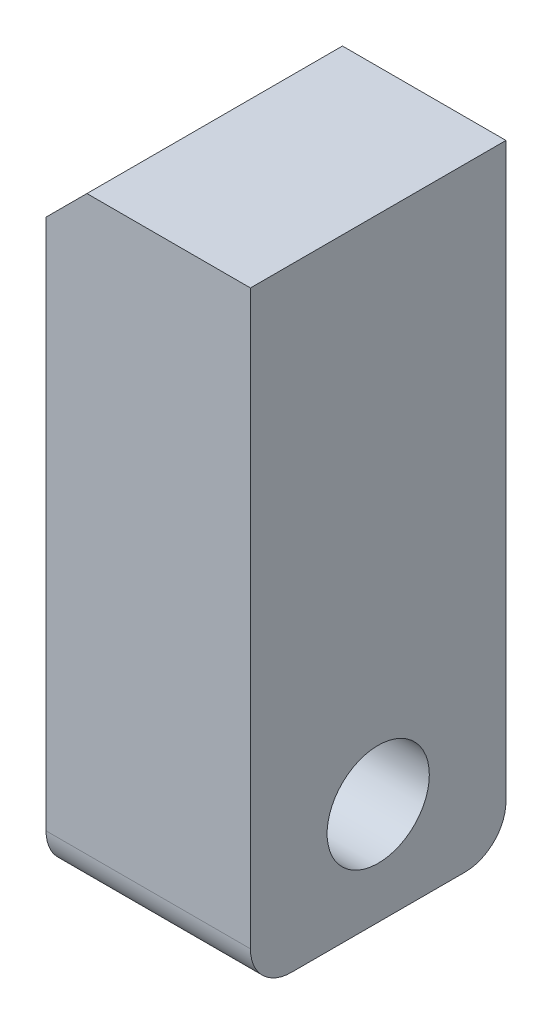
ISO-10303-21;
HEADER;
FILE_DESCRIPTION(('STEP AP214'),'2;1');
FILE_NAME('part.step','',(''),(''),'','','');
FILE_SCHEMA(('AUTOMOTIVE_DESIGN { 1 0 10303 214 1 1 1 1 }'));
ENDSEC;
DATA;
#1=APPLICATION_CONTEXT('core data for automotive mechanical design processes');
#2=APPLICATION_PROTOCOL_DEFINITION('international standard','automotive_design',2000,#1);
#3=PRODUCT_CONTEXT('',#1,'mechanical');
#4=PRODUCT('Part','Part','',(#3));
#5=PRODUCT_RELATED_PRODUCT_CATEGORY('part','',(#4));
#6=PRODUCT_DEFINITION_FORMATION('','',#4);
#7=PRODUCT_DEFINITION_CONTEXT('part definition',#1,'design');
#8=PRODUCT_DEFINITION('design','',#6,#7);
#9=PRODUCT_DEFINITION_SHAPE('','',#8);
#10=(LENGTH_UNIT() NAMED_UNIT(*) SI_UNIT(.MILLI.,.METRE.));
#11=(NAMED_UNIT(*) PLANE_ANGLE_UNIT() SI_UNIT($,.RADIAN.));
#12=(NAMED_UNIT(*) SI_UNIT($,.STERADIAN.) SOLID_ANGLE_UNIT());
#13=UNCERTAINTY_MEASURE_WITH_UNIT(LENGTH_MEASURE(1.E-05),#10,'distance_accuracy_value','');
#14=(GEOMETRIC_REPRESENTATION_CONTEXT(3) GLOBAL_UNCERTAINTY_ASSIGNED_CONTEXT((#13)) GLOBAL_UNIT_ASSIGNED_CONTEXT((#10,
#11,#12)) REPRESENTATION_CONTEXT('',''));
#15=CARTESIAN_POINT('',(0.,0.,0.));
#16=DIRECTION('',(0.,0.,1.));
#17=DIRECTION('',(1.,0.,0.));
#18=AXIS2_PLACEMENT_3D('',#15,#16,#17);
#19=CARTESIAN_POINT('',(10.,-15.,6.25));
#20=DIRECTION('',(0.,0.,-1.));
#21=DIRECTION('',(-1.,0.,0.));
#22=AXIS2_PLACEMENT_3D('',#19,#20,#21);
#23=PLANE('',#22);
#24=DIRECTION('',(-1.,0.,0.));
#25=VECTOR('',#24,1.);
#26=CARTESIAN_POINT('',(10.,15.,6.25));
#27=LINE('',#26,#25);
#28=CARTESIAN_POINT('',(10.,15.,6.25));
#29=VERTEX_POINT('',#28);
#30=CARTESIAN_POINT('',(2.,15.,6.25));
#31=VERTEX_POINT('',#30);
#32=EDGE_CURVE('E122',#29,#31,#27,.T.);
#33=ORIENTED_EDGE('',*,*,#32,.T.);
#34=DIRECTION('',(0.707106781186547,0.707106781186548,0.));
#35=VECTOR('',#34,1.);
#36=CARTESIAN_POINT('',(2.,15.,6.25));
#37=LINE('',#36,#35);
#38=CARTESIAN_POINT('',(0.,13.,6.25));
#39=VERTEX_POINT('',#38);
#40=EDGE_CURVE('E62',#31,#39,#37,.F.);
#41=ORIENTED_EDGE('',*,*,#40,.T.);
#42=DIRECTION('',(0.,-1.,0.));
#43=VECTOR('',#42,1.);
#44=CARTESIAN_POINT('',(0.,-15.,6.25));
#45=LINE('',#44,#43);
#46=CARTESIAN_POINT('',(0.,-13.,6.25));
#47=VERTEX_POINT('',#46);
#48=EDGE_CURVE('E132',#39,#47,#45,.T.);
#49=ORIENTED_EDGE('',*,*,#48,.T.);
#50=DIRECTION('',(-1.,0.,0.));
#51=VECTOR('',#50,1.);
#52=CARTESIAN_POINT('',(10.,-13.,6.25));
#53=LINE('',#52,#51);
#54=CARTESIAN_POINT('',(10.,-13.,6.25));
#55=VERTEX_POINT('',#54);
#56=EDGE_CURVE('E157',#47,#55,#53,.F.);
#57=ORIENTED_EDGE('',*,*,#56,.T.);
#58=DIRECTION('',(0.,-1.,0.));
#59=VECTOR('',#58,1.);
#60=CARTESIAN_POINT('',(10.,-15.,6.25));
#61=LINE('',#60,#59);
#62=EDGE_CURVE('E142',#29,#55,#61,.T.);
#63=ORIENTED_EDGE('',*,*,#62,.F.);
#64=EDGE_LOOP('',(#33,#41,#49,#57,#63));
#65=FACE_BOUND('',#64,.T.);
#66=ADVANCED_FACE('F39',(#65),#23,.F.);
#67=CARTESIAN_POINT('',(10.,-15.,-6.25));
#68=DIRECTION('',(0.,1.,0.));
#69=DIRECTION('',(0.,0.,1.));
#70=AXIS2_PLACEMENT_3D('',#67,#68,#69);
#71=PLANE('',#70);
#72=DIRECTION('',(0.,0.,-1.));
#73=VECTOR('',#72,1.);
#74=CARTESIAN_POINT('',(10.,-15.,-6.25));
#75=LINE('',#74,#73);
#76=CARTESIAN_POINT('',(10.,-15.,4.25));
#77=VERTEX_POINT('',#76);
#78=CARTESIAN_POINT('',(10.,-15.,-4.25));
#79=VERTEX_POINT('',#78);
#80=EDGE_CURVE('E111',#77,#79,#75,.T.);
#81=ORIENTED_EDGE('',*,*,#80,.F.);
#82=DIRECTION('',(-1.,0.,0.));
#83=VECTOR('',#82,1.);
#84=CARTESIAN_POINT('',(10.,-15.,4.25));
#85=LINE('',#84,#83);
#86=CARTESIAN_POINT('',(0.,-15.,4.25));
#87=VERTEX_POINT('',#86);
#88=EDGE_CURVE('E146',#77,#87,#85,.T.);
#89=ORIENTED_EDGE('',*,*,#88,.T.);
#90=DIRECTION('',(0.,0.,-1.));
#91=VECTOR('',#90,1.);
#92=CARTESIAN_POINT('',(0.,-15.,-6.25));
#93=LINE('',#92,#91);
#94=CARTESIAN_POINT('',(0.,-15.,-4.25));
#95=VERTEX_POINT('',#94);
#96=EDGE_CURVE('E135',#87,#95,#93,.T.);
#97=ORIENTED_EDGE('',*,*,#96,.T.);
#98=DIRECTION('',(-1.,0.,0.));
#99=VECTOR('',#98,1.);
#100=CARTESIAN_POINT('',(10.,-15.,-4.25));
#101=LINE('',#100,#99);
#102=EDGE_CURVE('E121',#95,#79,#101,.F.);
#103=ORIENTED_EDGE('',*,*,#102,.T.);
#104=EDGE_LOOP('',(#81,#89,#97,#103));
#105=FACE_BOUND('',#104,.T.);
#106=ADVANCED_FACE('F205',(#105),#71,.F.);
#107=CARTESIAN_POINT('',(10.,-15.,-6.25));
#108=DIRECTION('',(0.,0.,1.));
#109=DIRECTION('',(1.,0.,0.));
#110=AXIS2_PLACEMENT_3D('',#107,#108,#109);
#111=PLANE('',#110);
#112=DIRECTION('',(0.,1.,0.));
#113=VECTOR('',#112,1.);
#114=CARTESIAN_POINT('',(0.,-15.,-6.25));
#115=LINE('',#114,#113);
#116=CARTESIAN_POINT('',(0.,-13.,-6.25));
#117=VERTEX_POINT('',#116);
#118=CARTESIAN_POINT('',(0.,13.,-6.25));
#119=VERTEX_POINT('',#118);
#120=EDGE_CURVE('E140',#117,#119,#115,.T.);
#121=ORIENTED_EDGE('',*,*,#120,.T.);
#122=DIRECTION('',(-0.707106781186547,-0.707106781186548,0.));
#123=VECTOR('',#122,1.);
#124=CARTESIAN_POINT('',(2.,15.,-6.25));
#125=LINE('',#124,#123);
#126=CARTESIAN_POINT('',(2.,15.,-6.25));
#127=VERTEX_POINT('',#126);
#128=EDGE_CURVE('E11',#119,#127,#125,.F.);
#129=ORIENTED_EDGE('',*,*,#128,.T.);
#130=DIRECTION('',(-1.,0.,0.));
#131=VECTOR('',#130,1.);
#132=CARTESIAN_POINT('',(10.,15.,-6.25));
#133=LINE('',#132,#131);
#134=CARTESIAN_POINT('',(10.,15.,-6.25));
#135=VERTEX_POINT('',#134);
#136=EDGE_CURVE('E114',#135,#127,#133,.T.);
#137=ORIENTED_EDGE('',*,*,#136,.F.);
#138=DIRECTION('',(0.,1.,0.));
#139=VECTOR('',#138,1.);
#140=CARTESIAN_POINT('',(10.,-15.,-6.25));
#141=LINE('',#140,#139);
#142=CARTESIAN_POINT('',(10.,-13.,-6.25));
#143=VERTEX_POINT('',#142);
#144=EDGE_CURVE('E97',#143,#135,#141,.T.);
#145=ORIENTED_EDGE('',*,*,#144,.F.);
#146=DIRECTION('',(-1.,0.,0.));
#147=VECTOR('',#146,1.);
#148=CARTESIAN_POINT('',(10.,-13.,-6.25));
#149=LINE('',#148,#147);
#150=EDGE_CURVE('E165',#143,#117,#149,.T.);
#151=ORIENTED_EDGE('',*,*,#150,.T.);
#152=EDGE_LOOP('',(#121,#129,#137,#145,#151));
#153=FACE_BOUND('',#152,.T.);
#154=ADVANCED_FACE('F115',(#153),#111,.F.);
#155=CARTESIAN_POINT('',(10.,15.,-6.25));
#156=DIRECTION('',(0.,-1.,0.));
#157=DIRECTION('',(0.,0.,-1.));
#158=AXIS2_PLACEMENT_3D('',#155,#156,#157);
#159=PLANE('',#158);
#160=ORIENTED_EDGE('',*,*,#136,.T.);
#161=DIRECTION('',(0.,0.,1.));
#162=VECTOR('',#161,1.);
#163=CARTESIAN_POINT('',(2.,15.,-6.25));
#164=LINE('',#163,#162);
#165=EDGE_CURVE('E168',#127,#31,#164,.T.);
#166=ORIENTED_EDGE('',*,*,#165,.T.);
#167=ORIENTED_EDGE('',*,*,#32,.F.);
#168=DIRECTION('',(0.,0.,1.));
#169=VECTOR('',#168,1.);
#170=CARTESIAN_POINT('',(10.,15.,-6.25));
#171=LINE('',#170,#169);
#172=EDGE_CURVE('E102',#135,#29,#171,.T.);
#173=ORIENTED_EDGE('',*,*,#172,.F.);
#174=EDGE_LOOP('',(#160,#166,#167,#173));
#175=FACE_BOUND('',#174,.T.);
#176=ADVANCED_FACE('F124',(#175),#159,.F.);
#177=CARTESIAN_POINT('',(10.,0.,0.));
#178=DIRECTION('',(1.,0.,0.));
#179=DIRECTION('',(0.,0.,-1.));
#180=AXIS2_PLACEMENT_3D('',#177,#178,#179);
#181=PLANE('',#180);
#182=CARTESIAN_POINT('',(10.,-9.99999999999999,0.));
#183=DIRECTION('',(1.,0.,0.));
#184=DIRECTION('',(0.,0.,-1.));
#185=AXIS2_PLACEMENT_3D('',#182,#183,#184);
#186=CIRCLE('',#185,2.5);
#187=CARTESIAN_POINT('',(10.,-9.99999999999999,-2.5));
#188=VERTEX_POINT('',#187);
#189=EDGE_CURVE('E136',#188,#188,#186,.T.);
#190=ORIENTED_EDGE('',*,*,#189,.F.);
#191=EDGE_LOOP('',(#190));
#192=FACE_BOUND('',#191,.T.);
#193=ORIENTED_EDGE('',*,*,#62,.T.);
#194=CARTESIAN_POINT('',(10.,-13.,4.25));
#195=DIRECTION('',(1.,0.,0.));
#196=DIRECTION('',(0.,0.,-1.));
#197=AXIS2_PLACEMENT_3D('',#194,#195,#196);
#198=CIRCLE('',#197,2.);
#199=EDGE_CURVE('E162',#55,#77,#198,.T.);
#200=ORIENTED_EDGE('',*,*,#199,.T.);
#201=ORIENTED_EDGE('',*,*,#80,.T.);
#202=CARTESIAN_POINT('',(10.,-13.,-4.25));
#203=DIRECTION('',(1.,0.,0.));
#204=DIRECTION('',(0.,0.,-1.));
#205=AXIS2_PLACEMENT_3D('',#202,#203,#204);
#206=CIRCLE('',#205,2.);
#207=EDGE_CURVE('E106',#79,#143,#206,.T.);
#208=ORIENTED_EDGE('',*,*,#207,.T.);
#209=ORIENTED_EDGE('',*,*,#144,.T.);
#210=ORIENTED_EDGE('',*,*,#172,.T.);
#211=EDGE_LOOP('',(#193,#200,#201,#208,#209,#210));
#212=FACE_BOUND('',#211,.T.);
#213=ADVANCED_FACE('F100',(#192,#212),#181,.T.);
#214=CARTESIAN_POINT('',(0.,0.,0.));
#215=DIRECTION('',(1.,0.,0.));
#216=DIRECTION('',(0.,0.,-1.));
#217=AXIS2_PLACEMENT_3D('',#214,#215,#216);
#218=PLANE('',#217);
#219=CARTESIAN_POINT('',(0.,-9.99999999999999,0.));
#220=DIRECTION('',(1.,0.,0.));
#221=DIRECTION('',(0.,0.,-1.));
#222=AXIS2_PLACEMENT_3D('',#219,#220,#221);
#223=CIRCLE('',#222,2.5);
#224=CARTESIAN_POINT('',(0.,-9.99999999999999,-2.5));
#225=VERTEX_POINT('',#224);
#226=EDGE_CURVE('E183',#225,#225,#223,.T.);
#227=ORIENTED_EDGE('',*,*,#226,.T.);
#228=EDGE_LOOP('',(#227));
#229=FACE_BOUND('',#228,.T.);
#230=ORIENTED_EDGE('',*,*,#48,.F.);
#231=DIRECTION('',(0.,0.,-1.));
#232=VECTOR('',#231,1.);
#233=CARTESIAN_POINT('',(0.,13.,0.));
#234=LINE('',#233,#232);
#235=EDGE_CURVE('E48',#39,#119,#234,.T.);
#236=ORIENTED_EDGE('',*,*,#235,.T.);
#237=ORIENTED_EDGE('',*,*,#120,.F.);
#238=CARTESIAN_POINT('',(0.,-13.,-4.25));
#239=DIRECTION('',(1.,0.,0.));
#240=DIRECTION('',(0.,0.,-1.));
#241=AXIS2_PLACEMENT_3D('',#238,#239,#240);
#242=CIRCLE('',#241,2.);
#243=EDGE_CURVE('E150',#117,#95,#242,.F.);
#244=ORIENTED_EDGE('',*,*,#243,.T.);
#245=ORIENTED_EDGE('',*,*,#96,.F.);
#246=CARTESIAN_POINT('',(0.,-13.,4.25));
#247=DIRECTION('',(1.,0.,0.));
#248=DIRECTION('',(0.,0.,-1.));
#249=AXIS2_PLACEMENT_3D('',#246,#247,#248);
#250=CIRCLE('',#249,2.);
#251=EDGE_CURVE('E153',#87,#47,#250,.F.);
#252=ORIENTED_EDGE('',*,*,#251,.T.);
#253=EDGE_LOOP('',(#230,#236,#237,#244,#245,#252));
#254=FACE_BOUND('',#253,.T.);
#255=ADVANCED_FACE('F188',(#229,#254),#218,.F.);
#256=CARTESIAN_POINT('',(0.,-9.99999999999999,0.));
#257=DIRECTION('',(1.,0.,0.));
#258=DIRECTION('',(0.,0.,-1.));
#259=AXIS2_PLACEMENT_3D('',#256,#257,#258);
#260=CYLINDRICAL_SURFACE('',#259,2.5);
#261=ORIENTED_EDGE('',*,*,#189,.T.);
#262=EDGE_LOOP('',(#261));
#263=FACE_BOUND('',#262,.T.);
#264=ORIENTED_EDGE('',*,*,#226,.F.);
#265=EDGE_LOOP('',(#264));
#266=FACE_BOUND('',#265,.T.);
#267=ADVANCED_FACE('F190',(#263,#266),#260,.F.);
#268=CARTESIAN_POINT('',(10.,-13.,4.25));
#269=DIRECTION('',(-1.,0.,0.));
#270=DIRECTION('',(0.,0.,1.));
#271=AXIS2_PLACEMENT_3D('',#268,#269,#270);
#272=CYLINDRICAL_SURFACE('',#271,2.);
#273=ORIENTED_EDGE('',*,*,#199,.F.);
#274=ORIENTED_EDGE('',*,*,#56,.F.);
#275=ORIENTED_EDGE('',*,*,#251,.F.);
#276=ORIENTED_EDGE('',*,*,#88,.F.);
#277=EDGE_LOOP('',(#273,#274,#275,#276));
#278=FACE_BOUND('',#277,.T.);
#279=ADVANCED_FACE('F192',(#278),#272,.T.);
#280=CARTESIAN_POINT('',(10.,-13.,-4.25));
#281=DIRECTION('',(-1.,0.,0.));
#282=DIRECTION('',(0.,0.,1.));
#283=AXIS2_PLACEMENT_3D('',#280,#281,#282);
#284=CYLINDRICAL_SURFACE('',#283,2.);
#285=ORIENTED_EDGE('',*,*,#207,.F.);
#286=ORIENTED_EDGE('',*,*,#102,.F.);
#287=ORIENTED_EDGE('',*,*,#243,.F.);
#288=ORIENTED_EDGE('',*,*,#150,.F.);
#289=EDGE_LOOP('',(#285,#286,#287,#288));
#290=FACE_BOUND('',#289,.T.);
#291=ADVANCED_FACE('F199',(#290),#284,.T.);
#292=CARTESIAN_POINT('',(2.,15.,-6.25));
#293=DIRECTION('',(0.707106781186548,-0.707106781186547,0.));
#294=DIRECTION('',(0.,0.,1.));
#295=AXIS2_PLACEMENT_3D('',#292,#293,#294);
#296=PLANE('',#295);
#297=ORIENTED_EDGE('',*,*,#128,.F.);
#298=ORIENTED_EDGE('',*,*,#235,.F.);
#299=ORIENTED_EDGE('',*,*,#40,.F.);
#300=ORIENTED_EDGE('',*,*,#165,.F.);
#301=EDGE_LOOP('',(#297,#298,#299,#300));
#302=FACE_BOUND('',#301,.T.);
#303=ADVANCED_FACE('F41',(#302),#296,.F.);
#304=CLOSED_SHELL('',(#66,#106,#154,#176,#213,#255,#267,#279,#291,#303));
#305=MANIFOLD_SOLID_BREP('B2',#304);
#306=ADVANCED_BREP_SHAPE_REPRESENTATION('',(#18,#305),#14);
#307=SHAPE_DEFINITION_REPRESENTATION(#9,#306);
ENDSEC;
END-ISO-10303-21;
